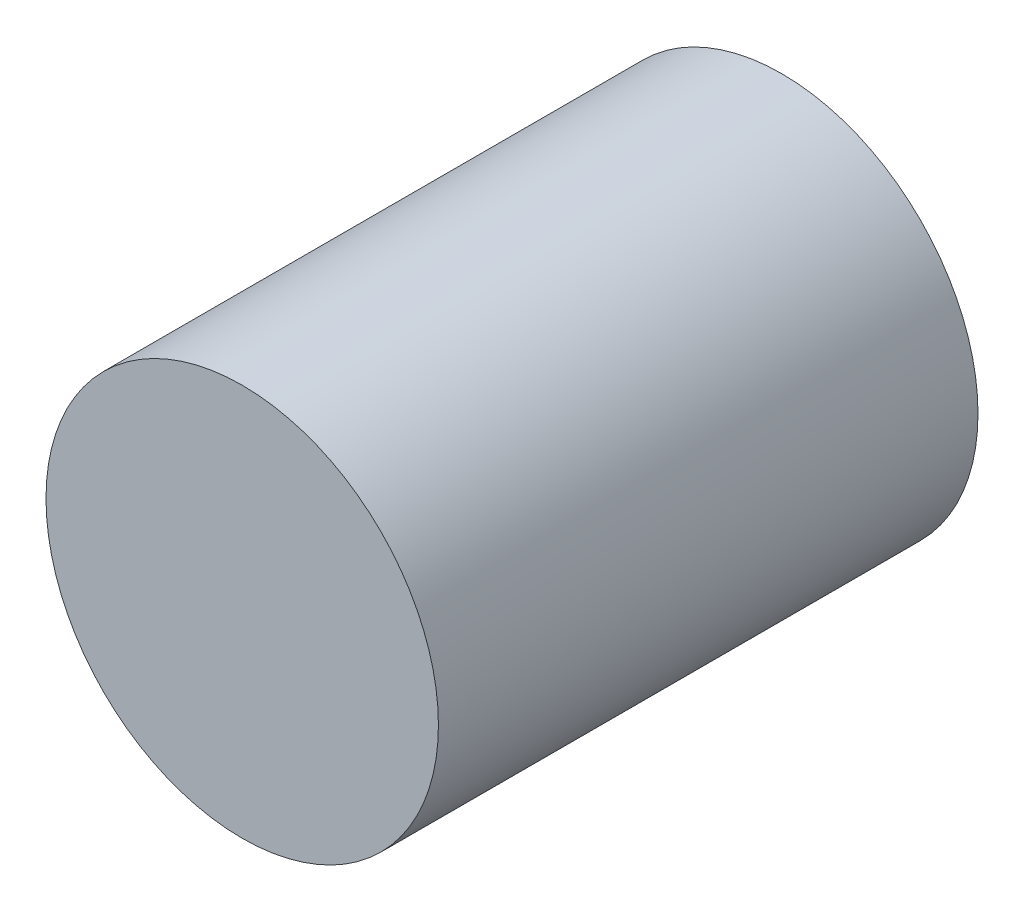
ISO-10303-21;
HEADER;
FILE_DESCRIPTION(('STEP AP214'),'2;1');
FILE_NAME('part.step','',(''),(''),'','','');
FILE_SCHEMA(('AUTOMOTIVE_DESIGN { 1 0 10303 214 1 1 1 1 }'));
ENDSEC;
DATA;
#1=APPLICATION_CONTEXT('core data for automotive mechanical design processes');
#2=APPLICATION_PROTOCOL_DEFINITION('international standard','automotive_design',2000,#1);
#3=PRODUCT_CONTEXT('',#1,'mechanical');
#4=PRODUCT('Part','Part','',(#3));
#5=PRODUCT_RELATED_PRODUCT_CATEGORY('part','',(#4));
#6=PRODUCT_DEFINITION_FORMATION('','',#4);
#7=PRODUCT_DEFINITION_CONTEXT('part definition',#1,'design');
#8=PRODUCT_DEFINITION('design','',#6,#7);
#9=PRODUCT_DEFINITION_SHAPE('','',#8);
#10=(LENGTH_UNIT() NAMED_UNIT(*) SI_UNIT(.MILLI.,.METRE.));
#11=(NAMED_UNIT(*) PLANE_ANGLE_UNIT() SI_UNIT($,.RADIAN.));
#12=(NAMED_UNIT(*) SI_UNIT($,.STERADIAN.) SOLID_ANGLE_UNIT());
#13=UNCERTAINTY_MEASURE_WITH_UNIT(LENGTH_MEASURE(1.E-05),#10,'distance_accuracy_value','');
#14=(GEOMETRIC_REPRESENTATION_CONTEXT(3) GLOBAL_UNCERTAINTY_ASSIGNED_CONTEXT((#13)) GLOBAL_UNIT_ASSIGNED_CONTEXT((#10,
#11,#12)) REPRESENTATION_CONTEXT('',''));
#15=CARTESIAN_POINT('',(0.,0.,0.));
#16=DIRECTION('',(0.,0.,1.));
#17=DIRECTION('',(1.,0.,0.));
#18=AXIS2_PLACEMENT_3D('',#15,#16,#17);
#19=CARTESIAN_POINT('',(0.,0.,55.));
#20=DIRECTION('',(0.,0.,-1.));
#21=DIRECTION('',(-1.,0.,0.));
#22=AXIS2_PLACEMENT_3D('',#19,#20,#21);
#23=CYLINDRICAL_SURFACE('',#22,20.);
#24=CARTESIAN_POINT('',(0.,0.,55.));
#25=DIRECTION('',(0.,0.,1.));
#26=DIRECTION('',(1.,0.,0.));
#27=AXIS2_PLACEMENT_3D('',#24,#25,#26);
#28=CIRCLE('',#27,20.);
#29=CARTESIAN_POINT('',(20.,0.,55.));
#30=VERTEX_POINT('',#29);
#31=EDGE_CURVE('E10',#30,#30,#28,.T.);
#32=ORIENTED_EDGE('',*,*,#31,.F.);
#33=EDGE_LOOP('',(#32));
#34=FACE_BOUND('',#33,.T.);
#35=CARTESIAN_POINT('',(0.,0.,0.));
#36=DIRECTION('',(0.,0.,1.));
#37=DIRECTION('',(1.,0.,0.));
#38=AXIS2_PLACEMENT_3D('',#35,#36,#37);
#39=CIRCLE('',#38,20.);
#40=CARTESIAN_POINT('',(20.,0.,0.));
#41=VERTEX_POINT('',#40);
#42=EDGE_CURVE('E37',#41,#41,#39,.T.);
#43=ORIENTED_EDGE('',*,*,#42,.T.);
#44=EDGE_LOOP('',(#43));
#45=FACE_BOUND('',#44,.T.);
#46=ADVANCED_FACE('F40',(#34,#45),#23,.T.);
#47=CARTESIAN_POINT('',(0.,0.,55.));
#48=DIRECTION('',(0.,0.,1.));
#49=DIRECTION('',(1.,0.,0.));
#50=AXIS2_PLACEMENT_3D('',#47,#48,#49);
#51=PLANE('',#50);
#52=ORIENTED_EDGE('',*,*,#31,.T.);
#53=EDGE_LOOP('',(#52));
#54=FACE_BOUND('',#53,.T.);
#55=ADVANCED_FACE('F55',(#54),#51,.T.);
#56=CARTESIAN_POINT('',(0.,0.,0.));
#57=DIRECTION('',(0.,0.,1.));
#58=DIRECTION('',(1.,0.,0.));
#59=AXIS2_PLACEMENT_3D('',#56,#57,#58);
#60=PLANE('',#59);
#61=ORIENTED_EDGE('',*,*,#42,.F.);
#62=EDGE_LOOP('',(#61));
#63=FACE_BOUND('',#62,.T.);
#64=ADVANCED_FACE('F49',(#63),#60,.F.);
#65=CLOSED_SHELL('',(#46,#55,#64));
#66=MANIFOLD_SOLID_BREP('B2',#65);
#67=ADVANCED_BREP_SHAPE_REPRESENTATION('',(#18,#66),#14);
#68=SHAPE_DEFINITION_REPRESENTATION(#9,#67);
ENDSEC;
END-ISO-10303-21;
